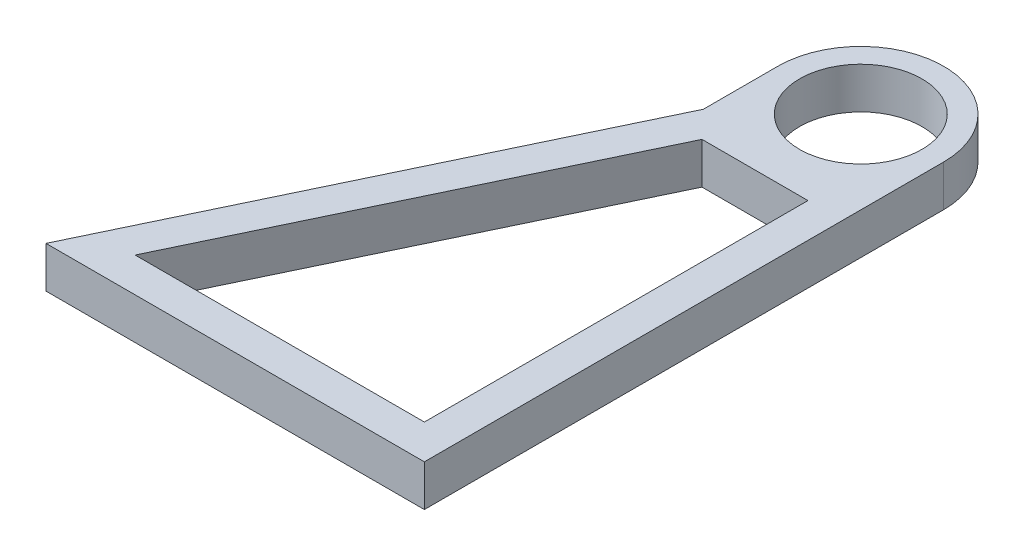
ISO-10303-21;
HEADER;
FILE_DESCRIPTION(('STEP AP214'),'2;1');
FILE_NAME('part.step','',(''),(''),'','','');
FILE_SCHEMA(('AUTOMOTIVE_DESIGN { 1 0 10303 214 1 1 1 1 }'));
ENDSEC;
DATA;
#1=APPLICATION_CONTEXT('core data for automotive mechanical design processes');
#2=APPLICATION_PROTOCOL_DEFINITION('international standard','automotive_design',2000,#1);
#3=PRODUCT_CONTEXT('',#1,'mechanical');
#4=PRODUCT('Part','Part','',(#3));
#5=PRODUCT_RELATED_PRODUCT_CATEGORY('part','',(#4));
#6=PRODUCT_DEFINITION_FORMATION('','',#4);
#7=PRODUCT_DEFINITION_CONTEXT('part definition',#1,'design');
#8=PRODUCT_DEFINITION('design','',#6,#7);
#9=PRODUCT_DEFINITION_SHAPE('','',#8);
#10=(LENGTH_UNIT() NAMED_UNIT(*) SI_UNIT(.MILLI.,.METRE.));
#11=(NAMED_UNIT(*) PLANE_ANGLE_UNIT() SI_UNIT($,.RADIAN.));
#12=(NAMED_UNIT(*) SI_UNIT($,.STERADIAN.) SOLID_ANGLE_UNIT());
#13=UNCERTAINTY_MEASURE_WITH_UNIT(LENGTH_MEASURE(1.E-05),#10,'distance_accuracy_value','');
#14=(GEOMETRIC_REPRESENTATION_CONTEXT(3) GLOBAL_UNCERTAINTY_ASSIGNED_CONTEXT((#13)) GLOBAL_UNIT_ASSIGNED_CONTEXT((#10,
#11,#12)) REPRESENTATION_CONTEXT('',''));
#15=CARTESIAN_POINT('',(0.,0.,0.));
#16=DIRECTION('',(0.,0.,1.));
#17=DIRECTION('',(1.,0.,0.));
#18=AXIS2_PLACEMENT_3D('',#15,#16,#17);
#19=CARTESIAN_POINT('',(0.,12.,0.));
#20=DIRECTION('',(0.,1.,0.));
#21=DIRECTION('',(0.,0.,1.));
#22=AXIS2_PLACEMENT_3D('',#19,#20,#21);
#23=PLANE('',#22);
#24=DIRECTION('',(-1.,0.,0.));
#25=VECTOR('',#24,1.);
#26=CARTESIAN_POINT('',(0.,12.,29.3842813837811));
#27=LINE('',#26,#25);
#28=CARTESIAN_POINT('',(14.0626005805632,12.,29.3842813837811));
#29=VERTEX_POINT('',#28);
#30=CARTESIAN_POINT('',(-16.6895528629257,12.,29.3842813837811));
#31=VERTEX_POINT('',#30);
#32=EDGE_CURVE('E137',#29,#31,#27,.T.);
#33=ORIENTED_EDGE('',*,*,#32,.F.);
#34=DIRECTION('',(0.,0.,-1.));
#35=VECTOR('',#34,1.);
#36=CARTESIAN_POINT('',(14.0626005805632,12.,0.));
#37=LINE('',#36,#35);
#38=CARTESIAN_POINT('',(14.0626005805632,12.,140.69249853));
#39=VERTEX_POINT('',#38);
#40=EDGE_CURVE('E130',#39,#29,#37,.T.);
#41=ORIENTED_EDGE('',*,*,#40,.F.);
#42=DIRECTION('',(1.,0.,0.));
#43=VECTOR('',#42,1.);
#44=CARTESIAN_POINT('',(0.,12.,140.69249853));
#45=LINE('',#44,#43);
#46=CARTESIAN_POINT('',(-69.8651260145114,12.,140.69249853));
#47=VERTEX_POINT('',#46);
#48=EDGE_CURVE('E110',#47,#39,#45,.T.);
#49=ORIENTED_EDGE('',*,*,#48,.F.);
#50=DIRECTION('',(-0.431067583519995,0.,0.902319643163238));
#51=VECTOR('',#50,1.);
#52=CARTESIAN_POINT('',(-2.15898040351958,12.,-1.03141549944496));
#53=LINE('',#52,#51);
#54=EDGE_CURVE('E135',#31,#47,#53,.T.);
#55=ORIENTED_EDGE('',*,*,#54,.F.);
#56=EDGE_LOOP('',(#33,#41,#49,#55));
#57=FACE_BOUND('',#56,.T.);
#58=CARTESIAN_POINT('',(0.,12.,0.));
#59=DIRECTION('',(0.,1.,0.));
#60=DIRECTION('',(0.,0.,1.));
#61=AXIS2_PLACEMENT_3D('',#58,#59,#60);
#62=CIRCLE('',#61,24.0626005805632);
#63=CARTESIAN_POINT('',(24.0626005805632,12.,0.));
#64=VERTEX_POINT('',#63);
#65=CARTESIAN_POINT('',(-24.0626005805632,12.,0.));
#66=VERTEX_POINT('',#65);
#67=EDGE_CURVE('E146',#64,#66,#62,.T.);
#68=ORIENTED_EDGE('',*,*,#67,.T.);
#69=DIRECTION('',(0.,0.,1.));
#70=VECTOR('',#69,1.);
#71=CARTESIAN_POINT('',(-24.0626005805632,12.,21.6194798947344));
#72=LINE('',#71,#70);
#73=CARTESIAN_POINT('',(-24.0626005805632,12.,21.6194798947344));
#74=VERTEX_POINT('',#73);
#75=EDGE_CURVE('E149',#66,#74,#72,.T.);
#76=ORIENTED_EDGE('',*,*,#75,.T.);
#77=DIRECTION('',(-0.431067583519995,0.,0.902319643163237));
#78=VECTOR('',#77,1.);
#79=CARTESIAN_POINT('',(-85.725,12.,150.69249853));
#80=LINE('',#79,#78);
#81=CARTESIAN_POINT('',(-85.725,12.,150.69249853));
#82=VERTEX_POINT('',#81);
#83=EDGE_CURVE('E152',#74,#82,#80,.T.);
#84=ORIENTED_EDGE('',*,*,#83,.T.);
#85=DIRECTION('',(1.,0.,0.));
#86=VECTOR('',#85,1.);
#87=CARTESIAN_POINT('',(-85.725,12.,150.69249853));
#88=LINE('',#87,#86);
#89=CARTESIAN_POINT('',(24.0626005805632,12.,150.69249853));
#90=VERTEX_POINT('',#89);
#91=EDGE_CURVE('E154',#82,#90,#88,.T.);
#92=ORIENTED_EDGE('',*,*,#91,.T.);
#93=DIRECTION('',(0.,0.,-1.));
#94=VECTOR('',#93,1.);
#95=CARTESIAN_POINT('',(24.0626005805632,12.,150.69249853));
#96=LINE('',#95,#94);
#97=EDGE_CURVE('E156',#90,#64,#96,.T.);
#98=ORIENTED_EDGE('',*,*,#97,.T.);
#99=EDGE_LOOP('',(#68,#76,#84,#92,#98));
#100=FACE_BOUND('',#99,.T.);
#101=CARTESIAN_POINT('',(0.,12.,0.));
#102=DIRECTION('',(0.,1.,0.));
#103=DIRECTION('',(0.,0.,1.));
#104=AXIS2_PLACEMENT_3D('',#101,#102,#103);
#105=CIRCLE('',#104,17.75);
#106=CARTESIAN_POINT('',(0.,12.,17.75));
#107=VERTEX_POINT('',#106);
#108=EDGE_CURVE('E140',#107,#107,#105,.T.);
#109=ORIENTED_EDGE('',*,*,#108,.F.);
#110=EDGE_LOOP('',(#109));
#111=FACE_BOUND('',#110,.T.);
#112=ADVANCED_FACE('F33',(#57,#100,#111),#23,.T.);
#113=CARTESIAN_POINT('',(0.,0.,0.));
#114=DIRECTION('',(0.,1.,0.));
#115=DIRECTION('',(0.,0.,1.));
#116=AXIS2_PLACEMENT_3D('',#113,#114,#115);
#117=PLANE('',#116);
#118=DIRECTION('',(0.,0.,1.));
#119=VECTOR('',#118,1.);
#120=CARTESIAN_POINT('',(14.0626005805632,0.,46.3228565745012));
#121=LINE('',#120,#119);
#122=CARTESIAN_POINT('',(14.0626005805632,0.,29.3842813837811));
#123=VERTEX_POINT('',#122);
#124=CARTESIAN_POINT('',(14.0626005805632,0.,140.69249853));
#125=VERTEX_POINT('',#124);
#126=EDGE_CURVE('E116',#123,#125,#121,.T.);
#127=ORIENTED_EDGE('',*,*,#126,.F.);
#128=DIRECTION('',(1.,0.,0.));
#129=VECTOR('',#128,1.);
#130=CARTESIAN_POINT('',(14.0626005805632,0.,29.3842813837811));
#131=LINE('',#130,#129);
#132=CARTESIAN_POINT('',(-16.6895528629257,0.,29.3842813837811));
#133=VERTEX_POINT('',#132);
#134=EDGE_CURVE('E56',#133,#123,#131,.T.);
#135=ORIENTED_EDGE('',*,*,#134,.F.);
#136=DIRECTION('',(0.431067583519995,0.,-0.902319643163238));
#137=VECTOR('',#136,1.);
#138=CARTESIAN_POINT('',(-69.8651260145114,0.,140.69249853));
#139=LINE('',#138,#137);
#140=CARTESIAN_POINT('',(-69.8651260145114,0.,140.69249853));
#141=VERTEX_POINT('',#140);
#142=EDGE_CURVE('E123',#141,#133,#139,.T.);
#143=ORIENTED_EDGE('',*,*,#142,.F.);
#144=DIRECTION('',(-1.,0.,0.));
#145=VECTOR('',#144,1.);
#146=CARTESIAN_POINT('',(14.0626005805632,0.,140.69249853));
#147=LINE('',#146,#145);
#148=EDGE_CURVE('E107',#125,#141,#147,.T.);
#149=ORIENTED_EDGE('',*,*,#148,.F.);
#150=EDGE_LOOP('',(#127,#135,#143,#149));
#151=FACE_BOUND('',#150,.T.);
#152=CARTESIAN_POINT('',(0.,0.,0.));
#153=DIRECTION('',(0.,1.,0.));
#154=DIRECTION('',(0.,0.,1.));
#155=AXIS2_PLACEMENT_3D('',#152,#153,#154);
#156=CIRCLE('',#155,24.0626005805632);
#157=CARTESIAN_POINT('',(24.0626005805632,0.,0.));
#158=VERTEX_POINT('',#157);
#159=CARTESIAN_POINT('',(-24.0626005805632,0.,0.));
#160=VERTEX_POINT('',#159);
#161=EDGE_CURVE('E143',#158,#160,#156,.T.);
#162=ORIENTED_EDGE('',*,*,#161,.F.);
#163=DIRECTION('',(0.,0.,-1.));
#164=VECTOR('',#163,1.);
#165=CARTESIAN_POINT('',(24.0626005805632,0.,150.69249853));
#166=LINE('',#165,#164);
#167=CARTESIAN_POINT('',(24.0626005805632,0.,150.69249853));
#168=VERTEX_POINT('',#167);
#169=EDGE_CURVE('E150',#168,#158,#166,.T.);
#170=ORIENTED_EDGE('',*,*,#169,.F.);
#171=DIRECTION('',(1.,0.,0.));
#172=VECTOR('',#171,1.);
#173=CARTESIAN_POINT('',(-85.725,0.,150.69249853));
#174=LINE('',#173,#172);
#175=CARTESIAN_POINT('',(-85.725,0.,150.69249853));
#176=VERTEX_POINT('',#175);
#177=EDGE_CURVE('E165',#176,#168,#174,.T.);
#178=ORIENTED_EDGE('',*,*,#177,.F.);
#179=DIRECTION('',(-0.431067583519995,0.,0.902319643163237));
#180=VECTOR('',#179,1.);
#181=CARTESIAN_POINT('',(-85.725,0.,150.69249853));
#182=LINE('',#181,#180);
#183=CARTESIAN_POINT('',(-24.0626005805632,0.,21.6194798947344));
#184=VERTEX_POINT('',#183);
#185=EDGE_CURVE('E163',#184,#176,#182,.T.);
#186=ORIENTED_EDGE('',*,*,#185,.F.);
#187=DIRECTION('',(0.,0.,1.));
#188=VECTOR('',#187,1.);
#189=CARTESIAN_POINT('',(-24.0626005805632,0.,21.6194798947344));
#190=LINE('',#189,#188);
#191=EDGE_CURVE('E161',#160,#184,#190,.T.);
#192=ORIENTED_EDGE('',*,*,#191,.F.);
#193=EDGE_LOOP('',(#162,#170,#178,#186,#192));
#194=FACE_BOUND('',#193,.T.);
#195=CARTESIAN_POINT('',(0.,0.,0.));
#196=DIRECTION('',(0.,1.,0.));
#197=DIRECTION('',(0.,0.,1.));
#198=AXIS2_PLACEMENT_3D('',#195,#196,#197);
#199=CIRCLE('',#198,17.75);
#200=CARTESIAN_POINT('',(0.,0.,17.75));
#201=VERTEX_POINT('',#200);
#202=EDGE_CURVE('E139',#201,#201,#199,.T.);
#203=ORIENTED_EDGE('',*,*,#202,.T.);
#204=EDGE_LOOP('',(#203));
#205=FACE_BOUND('',#204,.T.);
#206=ADVANCED_FACE('F120',(#151,#194,#205),#117,.F.);
#207=CARTESIAN_POINT('',(0.,12.,0.));
#208=DIRECTION('',(0.,-1.,0.));
#209=DIRECTION('',(0.,0.,-1.));
#210=AXIS2_PLACEMENT_3D('',#207,#208,#209);
#211=CYLINDRICAL_SURFACE('',#210,24.0626005805632);
#212=ORIENTED_EDGE('',*,*,#161,.T.);
#213=DIRECTION('',(0.,-1.,0.));
#214=VECTOR('',#213,1.);
#215=CARTESIAN_POINT('',(-24.0626005805632,12.,0.));
#216=LINE('',#215,#214);
#217=EDGE_CURVE('E11',#66,#160,#216,.T.);
#218=ORIENTED_EDGE('',*,*,#217,.F.);
#219=ORIENTED_EDGE('',*,*,#67,.F.);
#220=DIRECTION('',(0.,-1.,0.));
#221=VECTOR('',#220,1.);
#222=CARTESIAN_POINT('',(24.0626005805632,12.,0.));
#223=LINE('',#222,#221);
#224=EDGE_CURVE('E158',#64,#158,#223,.T.);
#225=ORIENTED_EDGE('',*,*,#224,.T.);
#226=EDGE_LOOP('',(#212,#218,#219,#225));
#227=FACE_BOUND('',#226,.T.);
#228=ADVANCED_FACE('F35',(#227),#211,.T.);
#229=CARTESIAN_POINT('',(-24.0626005805632,12.,21.6194798947344));
#230=DIRECTION('',(1.,0.,0.));
#231=DIRECTION('',(0.,0.,-1.));
#232=AXIS2_PLACEMENT_3D('',#229,#230,#231);
#233=PLANE('',#232);
#234=ORIENTED_EDGE('',*,*,#191,.T.);
#235=DIRECTION('',(0.,-1.,0.));
#236=VECTOR('',#235,1.);
#237=CARTESIAN_POINT('',(-24.0626005805632,12.,21.6194798947344));
#238=LINE('',#237,#236);
#239=EDGE_CURVE('E41',#74,#184,#238,.T.);
#240=ORIENTED_EDGE('',*,*,#239,.F.);
#241=ORIENTED_EDGE('',*,*,#75,.F.);
#242=ORIENTED_EDGE('',*,*,#217,.T.);
#243=EDGE_LOOP('',(#234,#240,#241,#242));
#244=FACE_BOUND('',#243,.T.);
#245=ADVANCED_FACE('F199',(#244),#233,.F.);
#246=CARTESIAN_POINT('',(-85.725,12.,150.69249853));
#247=DIRECTION('',(0.902319643163237,0.,0.431067583519995));
#248=DIRECTION('',(0.431067583519995,0.,-0.902319643163237));
#249=AXIS2_PLACEMENT_3D('',#246,#247,#248);
#250=PLANE('',#249);
#251=ORIENTED_EDGE('',*,*,#185,.T.);
#252=DIRECTION('',(0.,-1.,0.));
#253=VECTOR('',#252,1.);
#254=CARTESIAN_POINT('',(-85.725,12.,150.69249853));
#255=LINE('',#254,#253);
#256=EDGE_CURVE('E173',#82,#176,#255,.T.);
#257=ORIENTED_EDGE('',*,*,#256,.F.);
#258=ORIENTED_EDGE('',*,*,#83,.F.);
#259=ORIENTED_EDGE('',*,*,#239,.T.);
#260=EDGE_LOOP('',(#251,#257,#258,#259));
#261=FACE_BOUND('',#260,.T.);
#262=ADVANCED_FACE('F180',(#261),#250,.F.);
#263=CARTESIAN_POINT('',(-85.725,12.,150.69249853));
#264=DIRECTION('',(0.,0.,-1.));
#265=DIRECTION('',(-1.,0.,0.));
#266=AXIS2_PLACEMENT_3D('',#263,#264,#265);
#267=PLANE('',#266);
#268=ORIENTED_EDGE('',*,*,#177,.T.);
#269=DIRECTION('',(0.,-1.,0.));
#270=VECTOR('',#269,1.);
#271=CARTESIAN_POINT('',(24.0626005805632,12.,150.69249853));
#272=LINE('',#271,#270);
#273=EDGE_CURVE('E170',#90,#168,#272,.T.);
#274=ORIENTED_EDGE('',*,*,#273,.F.);
#275=ORIENTED_EDGE('',*,*,#91,.F.);
#276=ORIENTED_EDGE('',*,*,#256,.T.);
#277=EDGE_LOOP('',(#268,#274,#275,#276));
#278=FACE_BOUND('',#277,.T.);
#279=ADVANCED_FACE('F189',(#278),#267,.F.);
#280=CARTESIAN_POINT('',(24.0626005805632,12.,150.69249853));
#281=DIRECTION('',(-1.,0.,0.));
#282=DIRECTION('',(0.,0.,1.));
#283=AXIS2_PLACEMENT_3D('',#280,#281,#282);
#284=PLANE('',#283);
#285=ORIENTED_EDGE('',*,*,#169,.T.);
#286=ORIENTED_EDGE('',*,*,#224,.F.);
#287=ORIENTED_EDGE('',*,*,#97,.F.);
#288=ORIENTED_EDGE('',*,*,#273,.T.);
#289=EDGE_LOOP('',(#285,#286,#287,#288));
#290=FACE_BOUND('',#289,.T.);
#291=ADVANCED_FACE('F193',(#290),#284,.F.);
#292=CARTESIAN_POINT('',(0.,12.,0.));
#293=DIRECTION('',(0.,-1.,0.));
#294=DIRECTION('',(0.,0.,-1.));
#295=AXIS2_PLACEMENT_3D('',#292,#293,#294);
#296=CYLINDRICAL_SURFACE('',#295,17.75);
#297=ORIENTED_EDGE('',*,*,#108,.T.);
#298=EDGE_LOOP('',(#297));
#299=FACE_BOUND('',#298,.T.);
#300=ORIENTED_EDGE('',*,*,#202,.F.);
#301=EDGE_LOOP('',(#300));
#302=FACE_BOUND('',#301,.T.);
#303=ADVANCED_FACE('F214',(#299,#302),#296,.F.);
#304=CARTESIAN_POINT('',(14.0626005805632,37.,29.3842813837811));
#305=DIRECTION('',(0.,0.,-1.));
#306=DIRECTION('',(-1.,0.,0.));
#307=AXIS2_PLACEMENT_3D('',#304,#305,#306);
#308=PLANE('',#307);
#309=ORIENTED_EDGE('',*,*,#32,.T.);
#310=DIRECTION('',(0.,-1.,0.));
#311=VECTOR('',#310,1.);
#312=CARTESIAN_POINT('',(-16.6895528629257,37.,29.3842813837811));
#313=LINE('',#312,#311);
#314=EDGE_CURVE('E128',#31,#133,#313,.T.);
#315=ORIENTED_EDGE('',*,*,#314,.T.);
#316=ORIENTED_EDGE('',*,*,#134,.T.);
#317=DIRECTION('',(0.,-1.,0.));
#318=VECTOR('',#317,1.);
#319=CARTESIAN_POINT('',(14.0626005805632,37.,29.3842813837811));
#320=LINE('',#319,#318);
#321=EDGE_CURVE('E113',#29,#123,#320,.T.);
#322=ORIENTED_EDGE('',*,*,#321,.F.);
#323=EDGE_LOOP('',(#309,#315,#316,#322));
#324=FACE_BOUND('',#323,.T.);
#325=ADVANCED_FACE('F240',(#324),#308,.F.);
#326=CARTESIAN_POINT('',(-69.8651260145114,37.,140.69249853));
#327=DIRECTION('',(-0.902319643163237,0.,-0.431067583519995));
#328=DIRECTION('',(-0.431067583519995,0.,0.902319643163238));
#329=AXIS2_PLACEMENT_3D('',#326,#327,#328);
#330=PLANE('',#329);
#331=ORIENTED_EDGE('',*,*,#54,.T.);
#332=DIRECTION('',(0.,-1.,0.));
#333=VECTOR('',#332,1.);
#334=CARTESIAN_POINT('',(-69.8651260145114,37.,140.69249853));
#335=LINE('',#334,#333);
#336=EDGE_CURVE('E112',#47,#141,#335,.T.);
#337=ORIENTED_EDGE('',*,*,#336,.T.);
#338=ORIENTED_EDGE('',*,*,#142,.T.);
#339=ORIENTED_EDGE('',*,*,#314,.F.);
#340=EDGE_LOOP('',(#331,#337,#338,#339));
#341=FACE_BOUND('',#340,.T.);
#342=ADVANCED_FACE('F247',(#341),#330,.F.);
#343=CARTESIAN_POINT('',(14.0626005805632,37.,140.69249853));
#344=DIRECTION('',(0.,0.,1.));
#345=DIRECTION('',(1.,0.,0.));
#346=AXIS2_PLACEMENT_3D('',#343,#344,#345);
#347=PLANE('',#346);
#348=ORIENTED_EDGE('',*,*,#48,.T.);
#349=DIRECTION('',(0.,-1.,0.));
#350=VECTOR('',#349,1.);
#351=CARTESIAN_POINT('',(14.0626005805632,37.,140.69249853));
#352=LINE('',#351,#350);
#353=EDGE_CURVE('E48',#39,#125,#352,.T.);
#354=ORIENTED_EDGE('',*,*,#353,.T.);
#355=ORIENTED_EDGE('',*,*,#148,.T.);
#356=ORIENTED_EDGE('',*,*,#336,.F.);
#357=EDGE_LOOP('',(#348,#354,#355,#356));
#358=FACE_BOUND('',#357,.T.);
#359=ADVANCED_FACE('F104',(#358),#347,.F.);
#360=CARTESIAN_POINT('',(14.0626005805632,37.,46.3228565745012));
#361=DIRECTION('',(1.,0.,0.));
#362=DIRECTION('',(0.,0.,-1.));
#363=AXIS2_PLACEMENT_3D('',#360,#361,#362);
#364=PLANE('',#363);
#365=ORIENTED_EDGE('',*,*,#40,.T.);
#366=ORIENTED_EDGE('',*,*,#321,.T.);
#367=ORIENTED_EDGE('',*,*,#126,.T.);
#368=ORIENTED_EDGE('',*,*,#353,.F.);
#369=EDGE_LOOP('',(#365,#366,#367,#368));
#370=FACE_BOUND('',#369,.T.);
#371=ADVANCED_FACE('F117',(#370),#364,.F.);
#372=CLOSED_SHELL('',(#112,#206,#228,#245,#262,#279,#291,#303,#325,#342,#359,#371));
#373=MANIFOLD_SOLID_BREP('B2',#372);
#374=ADVANCED_BREP_SHAPE_REPRESENTATION('',(#18,#373),#14);
#375=SHAPE_DEFINITION_REPRESENTATION(#9,#374);
ENDSEC;
END-ISO-10303-21;
